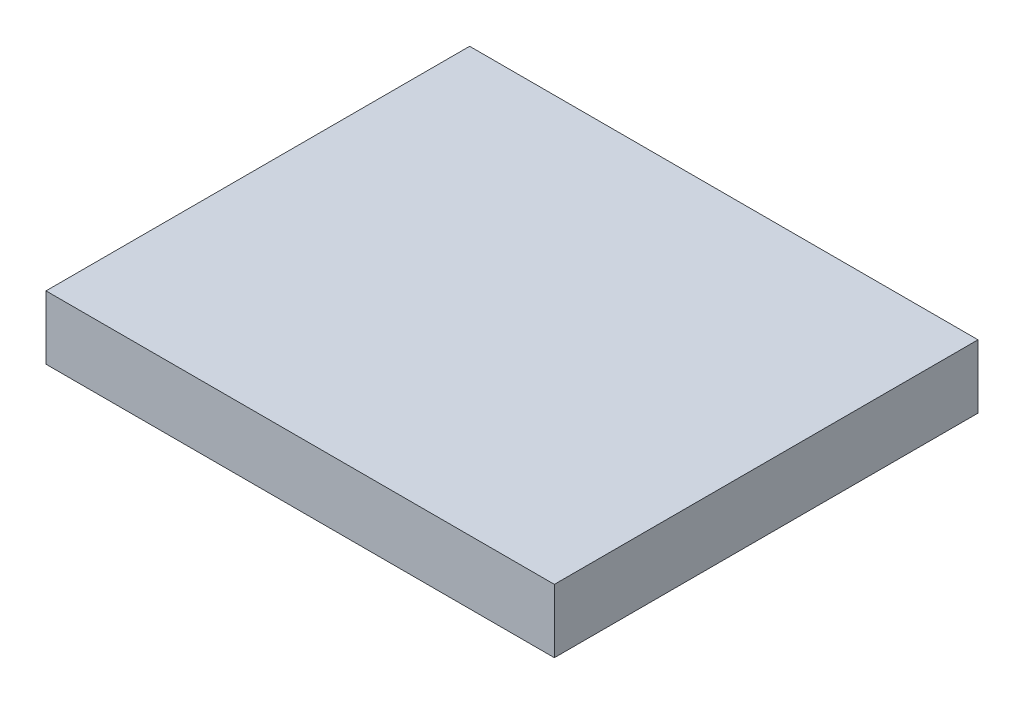
ISO-10303-21;
HEADER;
FILE_DESCRIPTION(('STEP AP214'),'2;1');
FILE_NAME('part.step','',(''),(''),'','','');
FILE_SCHEMA(('AUTOMOTIVE_DESIGN { 1 0 10303 214 1 1 1 1 }'));
ENDSEC;
DATA;
#1=APPLICATION_CONTEXT('core data for automotive mechanical design processes');
#2=APPLICATION_PROTOCOL_DEFINITION('international standard','automotive_design',2000,#1);
#3=PRODUCT_CONTEXT('',#1,'mechanical');
#4=PRODUCT('Part','Part','',(#3));
#5=PRODUCT_RELATED_PRODUCT_CATEGORY('part','',(#4));
#6=PRODUCT_DEFINITION_FORMATION('','',#4);
#7=PRODUCT_DEFINITION_CONTEXT('part definition',#1,'design');
#8=PRODUCT_DEFINITION('design','',#6,#7);
#9=PRODUCT_DEFINITION_SHAPE('','',#8);
#10=(LENGTH_UNIT() NAMED_UNIT(*) SI_UNIT(.MILLI.,.METRE.));
#11=(NAMED_UNIT(*) PLANE_ANGLE_UNIT() SI_UNIT($,.RADIAN.));
#12=(NAMED_UNIT(*) SI_UNIT($,.STERADIAN.) SOLID_ANGLE_UNIT());
#13=UNCERTAINTY_MEASURE_WITH_UNIT(LENGTH_MEASURE(1.E-05),#10,'distance_accuracy_value','');
#14=(GEOMETRIC_REPRESENTATION_CONTEXT(3) GLOBAL_UNCERTAINTY_ASSIGNED_CONTEXT((#13)) GLOBAL_UNIT_ASSIGNED_CONTEXT((#10,
#11,#12)) REPRESENTATION_CONTEXT('',''));
#15=CARTESIAN_POINT('',(0.,0.,0.));
#16=DIRECTION('',(0.,0.,1.));
#17=DIRECTION('',(1.,0.,0.));
#18=AXIS2_PLACEMENT_3D('',#15,#16,#17);
#19=CARTESIAN_POINT('',(609.6,152.4,-508.));
#20=DIRECTION('',(-1.,0.,0.));
#21=DIRECTION('',(0.,0.,1.));
#22=AXIS2_PLACEMENT_3D('',#19,#20,#21);
#23=PLANE('',#22);
#24=DIRECTION('',(0.,0.,-1.));
#25=VECTOR('',#24,1.);
#26=CARTESIAN_POINT('',(609.6,0.,-508.));
#27=LINE('',#26,#25);
#28=CARTESIAN_POINT('',(609.6,0.,508.));
#29=VERTEX_POINT('',#28);
#30=CARTESIAN_POINT('',(609.6,0.,-508.));
#31=VERTEX_POINT('',#30);
#32=EDGE_CURVE('E100',#29,#31,#27,.T.);
#33=ORIENTED_EDGE('',*,*,#32,.T.);
#34=DIRECTION('',(0.,-1.,0.));
#35=VECTOR('',#34,1.);
#36=CARTESIAN_POINT('',(609.6,152.4,-508.));
#37=LINE('',#36,#35);
#38=CARTESIAN_POINT('',(609.6,152.4,-508.));
#39=VERTEX_POINT('',#38);
#40=EDGE_CURVE('E11',#39,#31,#37,.T.);
#41=ORIENTED_EDGE('',*,*,#40,.F.);
#42=DIRECTION('',(0.,0.,-1.));
#43=VECTOR('',#42,1.);
#44=CARTESIAN_POINT('',(609.6,152.4,-508.));
#45=LINE('',#44,#43);
#46=CARTESIAN_POINT('',(609.6,152.4,508.));
#47=VERTEX_POINT('',#46);
#48=EDGE_CURVE('E88',#47,#39,#45,.T.);
#49=ORIENTED_EDGE('',*,*,#48,.F.);
#50=DIRECTION('',(0.,-1.,0.));
#51=VECTOR('',#50,1.);
#52=CARTESIAN_POINT('',(609.6,152.4,508.));
#53=LINE('',#52,#51);
#54=EDGE_CURVE('E96',#47,#29,#53,.T.);
#55=ORIENTED_EDGE('',*,*,#54,.T.);
#56=EDGE_LOOP('',(#33,#41,#49,#55));
#57=FACE_BOUND('',#56,.T.);
#58=ADVANCED_FACE('F37',(#57),#23,.F.);
#59=CARTESIAN_POINT('',(-609.6,152.4,-508.));
#60=DIRECTION('',(0.,0.,1.));
#61=DIRECTION('',(1.,0.,0.));
#62=AXIS2_PLACEMENT_3D('',#59,#60,#61);
#63=PLANE('',#62);
#64=DIRECTION('',(-1.,0.,0.));
#65=VECTOR('',#64,1.);
#66=CARTESIAN_POINT('',(-609.6,0.,-508.));
#67=LINE('',#66,#65);
#68=CARTESIAN_POINT('',(-609.6,0.,-508.));
#69=VERTEX_POINT('',#68);
#70=EDGE_CURVE('E92',#31,#69,#67,.T.);
#71=ORIENTED_EDGE('',*,*,#70,.T.);
#72=DIRECTION('',(0.,-1.,0.));
#73=VECTOR('',#72,1.);
#74=CARTESIAN_POINT('',(-609.6,152.4,-508.));
#75=LINE('',#74,#73);
#76=CARTESIAN_POINT('',(-609.6,152.4,-508.));
#77=VERTEX_POINT('',#76);
#78=EDGE_CURVE('E45',#77,#69,#75,.T.);
#79=ORIENTED_EDGE('',*,*,#78,.F.);
#80=DIRECTION('',(-1.,0.,0.));
#81=VECTOR('',#80,1.);
#82=CARTESIAN_POINT('',(-609.6,152.4,-508.));
#83=LINE('',#82,#81);
#84=EDGE_CURVE('E83',#39,#77,#83,.T.);
#85=ORIENTED_EDGE('',*,*,#84,.F.);
#86=ORIENTED_EDGE('',*,*,#40,.T.);
#87=EDGE_LOOP('',(#71,#79,#85,#86));
#88=FACE_BOUND('',#87,.T.);
#89=ADVANCED_FACE('F91',(#88),#63,.F.);
#90=CARTESIAN_POINT('',(-609.6,152.4,-508.));
#91=DIRECTION('',(1.,0.,0.));
#92=DIRECTION('',(0.,0.,-1.));
#93=AXIS2_PLACEMENT_3D('',#90,#91,#92);
#94=PLANE('',#93);
#95=DIRECTION('',(0.,0.,1.));
#96=VECTOR('',#95,1.);
#97=CARTESIAN_POINT('',(-609.6,0.,-508.));
#98=LINE('',#97,#96);
#99=CARTESIAN_POINT('',(-609.6,0.,508.));
#100=VERTEX_POINT('',#99);
#101=EDGE_CURVE('E70',#69,#100,#98,.T.);
#102=ORIENTED_EDGE('',*,*,#101,.T.);
#103=DIRECTION('',(0.,-1.,0.));
#104=VECTOR('',#103,1.);
#105=CARTESIAN_POINT('',(-609.6,152.4,508.));
#106=LINE('',#105,#104);
#107=CARTESIAN_POINT('',(-609.6,152.4,508.));
#108=VERTEX_POINT('',#107);
#109=EDGE_CURVE('E93',#108,#100,#106,.T.);
#110=ORIENTED_EDGE('',*,*,#109,.F.);
#111=DIRECTION('',(0.,0.,1.));
#112=VECTOR('',#111,1.);
#113=CARTESIAN_POINT('',(-609.6,152.4,-508.));
#114=LINE('',#113,#112);
#115=EDGE_CURVE('E86',#77,#108,#114,.T.);
#116=ORIENTED_EDGE('',*,*,#115,.F.);
#117=ORIENTED_EDGE('',*,*,#78,.T.);
#118=EDGE_LOOP('',(#102,#110,#116,#117));
#119=FACE_BOUND('',#118,.T.);
#120=ADVANCED_FACE('F94',(#119),#94,.F.);
#121=CARTESIAN_POINT('',(-609.6,152.4,508.));
#122=DIRECTION('',(0.,0.,-1.));
#123=DIRECTION('',(-1.,0.,0.));
#124=AXIS2_PLACEMENT_3D('',#121,#122,#123);
#125=PLANE('',#124);
#126=DIRECTION('',(1.,0.,0.));
#127=VECTOR('',#126,1.);
#128=CARTESIAN_POINT('',(-609.6,0.,508.));
#129=LINE('',#128,#127);
#130=EDGE_CURVE('E76',#100,#29,#129,.T.);
#131=ORIENTED_EDGE('',*,*,#130,.T.);
#132=ORIENTED_EDGE('',*,*,#54,.F.);
#133=DIRECTION('',(1.,0.,0.));
#134=VECTOR('',#133,1.);
#135=CARTESIAN_POINT('',(-609.6,152.4,508.));
#136=LINE('',#135,#134);
#137=EDGE_CURVE('E53',#108,#47,#136,.T.);
#138=ORIENTED_EDGE('',*,*,#137,.F.);
#139=ORIENTED_EDGE('',*,*,#109,.T.);
#140=EDGE_LOOP('',(#131,#132,#138,#139));
#141=FACE_BOUND('',#140,.T.);
#142=ADVANCED_FACE('F107',(#141),#125,.F.);
#143=CARTESIAN_POINT('',(0.,152.4,0.));
#144=DIRECTION('',(0.,1.,0.));
#145=DIRECTION('',(0.,0.,1.));
#146=AXIS2_PLACEMENT_3D('',#143,#144,#145);
#147=PLANE('',#146);
#148=ORIENTED_EDGE('',*,*,#48,.T.);
#149=ORIENTED_EDGE('',*,*,#84,.T.);
#150=ORIENTED_EDGE('',*,*,#115,.T.);
#151=ORIENTED_EDGE('',*,*,#137,.T.);
#152=EDGE_LOOP('',(#148,#149,#150,#151));
#153=FACE_BOUND('',#152,.T.);
#154=ADVANCED_FACE('F84',(#153),#147,.T.);
#155=CARTESIAN_POINT('',(0.,0.,0.));
#156=DIRECTION('',(0.,1.,0.));
#157=DIRECTION('',(0.,0.,1.));
#158=AXIS2_PLACEMENT_3D('',#155,#156,#157);
#159=PLANE('',#158);
#160=ORIENTED_EDGE('',*,*,#32,.F.);
#161=ORIENTED_EDGE('',*,*,#130,.F.);
#162=ORIENTED_EDGE('',*,*,#101,.F.);
#163=ORIENTED_EDGE('',*,*,#70,.F.);
#164=EDGE_LOOP('',(#160,#161,#162,#163));
#165=FACE_BOUND('',#164,.T.);
#166=ADVANCED_FACE('F110',(#165),#159,.F.);
#167=CLOSED_SHELL('',(#58,#89,#120,#142,#154,#166));
#168=MANIFOLD_SOLID_BREP('B2',#167);
#169=ADVANCED_BREP_SHAPE_REPRESENTATION('',(#18,#168),#14);
#170=SHAPE_DEFINITION_REPRESENTATION(#9,#169);
ENDSEC;
END-ISO-10303-21;
